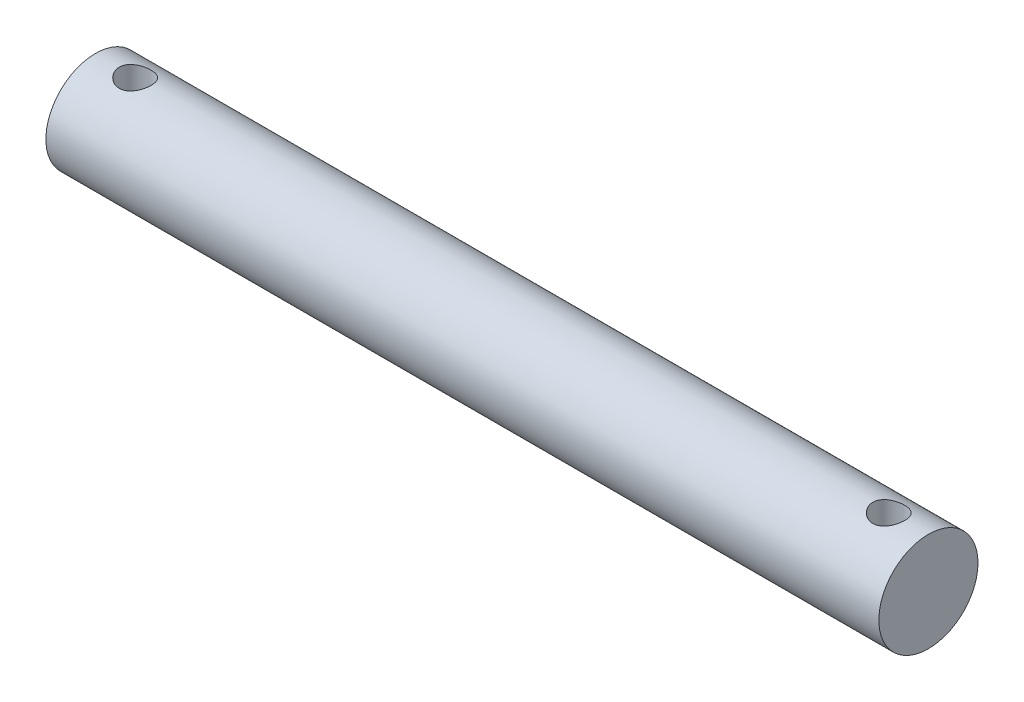
ISO-10303-21;
HEADER;
FILE_DESCRIPTION(('STEP AP214'),'2;1');
FILE_NAME('part.step','',(''),(''),'','','');
FILE_SCHEMA(('AUTOMOTIVE_DESIGN { 1 0 10303 214 1 1 1 1 }'));
ENDSEC;
DATA;
#1=APPLICATION_CONTEXT('core data for automotive mechanical design processes');
#2=APPLICATION_PROTOCOL_DEFINITION('international standard','automotive_design',2000,#1);
#3=PRODUCT_CONTEXT('',#1,'mechanical');
#4=PRODUCT('Part','Part','',(#3));
#5=PRODUCT_RELATED_PRODUCT_CATEGORY('part','',(#4));
#6=PRODUCT_DEFINITION_FORMATION('','',#4);
#7=PRODUCT_DEFINITION_CONTEXT('part definition',#1,'design');
#8=PRODUCT_DEFINITION('design','',#6,#7);
#9=PRODUCT_DEFINITION_SHAPE('','',#8);
#10=(LENGTH_UNIT() NAMED_UNIT(*) SI_UNIT(.MILLI.,.METRE.));
#11=(NAMED_UNIT(*) PLANE_ANGLE_UNIT() SI_UNIT($,.RADIAN.));
#12=(NAMED_UNIT(*) SI_UNIT($,.STERADIAN.) SOLID_ANGLE_UNIT());
#13=UNCERTAINTY_MEASURE_WITH_UNIT(LENGTH_MEASURE(1.E-05),#10,'distance_accuracy_value','');
#14=(GEOMETRIC_REPRESENTATION_CONTEXT(3) GLOBAL_UNCERTAINTY_ASSIGNED_CONTEXT((#13)) GLOBAL_UNIT_ASSIGNED_CONTEXT((#10,
#11,#12)) REPRESENTATION_CONTEXT('',''));
#15=CARTESIAN_POINT('',(0.,0.,0.));
#16=DIRECTION('',(0.,0.,1.));
#17=DIRECTION('',(1.,0.,0.));
#18=AXIS2_PLACEMENT_3D('',#15,#16,#17);
#19=CARTESIAN_POINT('',(210.,0.,0.));
#20=DIRECTION('',(-1.,0.,0.));
#21=DIRECTION('',(0.,0.,1.));
#22=AXIS2_PLACEMENT_3D('',#19,#20,#21);
#23=CYLINDRICAL_SURFACE('',#22,12.5);
#24=CARTESIAN_POINT('',(200.,-11.842719282327,3.99999999999999));
#25=CARTESIAN_POINT('',(200.218415594973,-11.8427199699566,3.99999935935301));
#26=CARTESIAN_POINT('',(200.436838759386,-11.8488277399487,3.98204982916321));
#27=CARTESIAN_POINT('',(200.86724896905,-11.8724842974625,3.91094422931103));
#28=CARTESIAN_POINT('',(201.079234509174,-11.8900357393061,3.85777999166794));
#29=CARTESIAN_POINT('',(201.490470254102,-11.9343925365716,3.71827554706383));
#30=CARTESIAN_POINT('',(201.689743063255,-11.9611808918508,3.6319962541729));
#31=CARTESIAN_POINT('',(202.071044102555,-12.0209691387475,3.42891586136008));
#32=CARTESIAN_POINT('',(202.253069000922,-12.0539702268166,3.31210888071351));
#33=CARTESIAN_POINT('',(202.601265987829,-12.1237992191192,3.04678104882873));
#34=CARTESIAN_POINT('',(202.766725413687,-12.1607169507637,2.89734836823299));
#35=CARTESIAN_POINT('',(203.07071606466,-12.2334570053411,2.57296030582543));
#36=CARTESIAN_POINT('',(203.209243336555,-12.269279166812,2.39800118371828));
#37=CARTESIAN_POINT('',(203.45861346325,-12.3368238271391,2.02237355615694));
#38=CARTESIAN_POINT('',(203.568717873273,-12.3684282786178,1.82119171965248));
#39=CARTESIAN_POINT('',(203.753246409914,-12.4229242661366,1.40198048377137));
#40=CARTESIAN_POINT('',(203.827679354407,-12.4458179551613,1.18395526351672));
#41=CARTESIAN_POINT('',(203.936359448071,-12.479676950379,0.744711775297697));
#42=CARTESIAN_POINT('',(203.971825644154,-12.4910032748545,0.523823472185486));
#43=CARTESIAN_POINT('',(204.005432763753,-12.5017287029849,0.0789603248012319));
#44=CARTESIAN_POINT('',(204.003582572004,-12.5011306457409,-0.145013772077125));
#45=CARTESIAN_POINT('',(203.963401245069,-12.4883236997896,-0.581093729167383));
#46=CARTESIAN_POINT('',(203.926392505398,-12.4765357034484,-0.79333579075878));
#47=CARTESIAN_POINT('',(203.819120441897,-12.4431948493389,-1.20842073412411));
#48=CARTESIAN_POINT('',(203.74885491586,-12.4216413449197,-1.41126299248277));
#49=CARTESIAN_POINT('',(203.576241918706,-12.3706365500491,-1.80478487403706));
#50=CARTESIAN_POINT('',(203.473502046017,-12.3410893332516,-1.99527942968321));
#51=CARTESIAN_POINT('',(203.239174482753,-12.2771970855206,-2.35672859352837));
#52=CARTESIAN_POINT('',(203.10757923132,-12.2428507979634,-2.52767806251325));
#53=CARTESIAN_POINT('',(202.812530895671,-12.1712367294856,-2.85306381310669));
#54=CARTESIAN_POINT('',(202.64793909237,-12.1339068619232,-3.00645534449559));
#55=CARTESIAN_POINT('',(202.295029347537,-12.0618145989439,-3.28378018395938));
#56=CARTESIAN_POINT('',(202.106708326059,-12.0270525377475,-3.40770966195435));
#57=CARTESIAN_POINT('',(201.708608149309,-11.9637089339779,-3.62388810953954));
#58=CARTESIAN_POINT('',(201.498594811739,-11.9352081440021,-3.7157312608837));
#59=CARTESIAN_POINT('',(201.064947984203,-11.8885562852076,-3.86241154371649));
#60=CARTESIAN_POINT('',(200.841319707077,-11.8704012824717,-3.9172627426085));
#61=CARTESIAN_POINT('',(200.396840224735,-11.8473757948988,-3.98634732980606));
#62=CARTESIAN_POINT('',(200.176265879178,-11.8419801089925,-4.0021876938619));
#63=CARTESIAN_POINT('',(199.735589323664,-11.8436224693089,-3.99732669767184));
#64=CARTESIAN_POINT('',(199.515487042269,-11.8506584784444,-3.97663132425953));
#65=CARTESIAN_POINT('',(199.089057431638,-11.8758511036107,-3.90072533361949));
#66=CARTESIAN_POINT('',(198.882514633253,-11.8936586123319,-3.84659716428485));
#67=CARTESIAN_POINT('',(198.48147210065,-11.9380128770361,-3.70664280725108));
#68=CARTESIAN_POINT('',(198.286974399074,-11.9645611032884,-3.62081128645949));
#69=CARTESIAN_POINT('',(197.909130382095,-12.0243860591649,-3.41697396012588));
#70=CARTESIAN_POINT('',(197.726288602977,-12.0578396098649,-3.29808617389175));
#71=CARTESIAN_POINT('',(197.382566444541,-12.1273479833206,-3.03252999413196));
#72=CARTESIAN_POINT('',(197.221692064979,-12.1634035126375,-2.88585403708637));
#73=CARTESIAN_POINT('',(196.919202223414,-12.2359628130699,-2.56125244512297));
#74=CARTESIAN_POINT('',(196.778737996041,-12.2724171226716,-2.38223997872511));
#75=CARTESIAN_POINT('',(196.529787306808,-12.3400966382304,-2.00229721221567));
#76=CARTESIAN_POINT('',(196.421299479696,-12.3713220674134,-1.80136784836229));
#77=CARTESIAN_POINT('',(196.240410006831,-12.4248572290492,-1.38445940226066));
#78=CARTESIAN_POINT('',(196.167754703966,-12.4472294035216,-1.16859881389168));
#79=CARTESIAN_POINT('',(196.060039739723,-12.480810616577,-0.726874957063016));
#80=CARTESIAN_POINT('',(196.024967681683,-12.4920233359687,-0.501015012458277));
#81=CARTESIAN_POINT('',(195.994460730251,-12.5017663129826,-0.0562765879062725));
#82=CARTESIAN_POINT('',(195.997366712425,-12.5008274477244,0.162477761236087));
#83=CARTESIAN_POINT('',(196.038692711946,-12.4876568899275,0.596238594775689));
#84=CARTESIAN_POINT('',(196.077110219501,-12.4754259954572,0.811245342941914));
#85=CARTESIAN_POINT('',(196.187295676915,-12.4412233539435,1.22850760398064));
#86=CARTESIAN_POINT('',(196.258600931114,-12.4193869374855,1.4308971714329));
#87=CARTESIAN_POINT('',(196.432116523931,-12.3682230993078,1.82093134276041));
#88=CARTESIAN_POINT('',(196.534332279587,-12.3388943647058,2.00857335487159));
#89=CARTESIAN_POINT('',(196.770902769464,-12.2745138549376,2.37094464163665));
#90=CARTESIAN_POINT('',(196.906258090511,-12.2392975634481,2.54499113183173));
#91=CARTESIAN_POINT('',(197.203523189601,-12.1675595998111,2.86844801950663));
#92=CARTESIAN_POINT('',(197.365441099235,-12.1310375306124,3.0178508446577));
#93=CARTESIAN_POINT('',(197.71806661409,-12.0592883124172,3.29310491309764));
#94=CARTESIAN_POINT('',(197.909587505179,-12.024152110656,3.41794102245578));
#95=CARTESIAN_POINT('',(198.311961764182,-11.9607741956668,3.63353471705188));
#96=CARTESIAN_POINT('',(198.522808227607,-11.9325300332104,3.72430441468118));
#97=CARTESIAN_POINT('',(198.942457102771,-11.8881467072459,3.86354015966021));
#98=CARTESIAN_POINT('',(199.150337889714,-11.8712893448615,3.91455627646291));
#99=CARTESIAN_POINT('',(199.572144497048,-11.8485768271906,3.98278180434111));
#100=CARTESIAN_POINT('',(199.786068617614,-11.8427186088149,4.00000062749408));
#101=CARTESIAN_POINT('',(200.,-11.842719282327,3.99999999999999));
#102=B_SPLINE_CURVE_WITH_KNOTS('',3,(#24,#25,#26,#27,#28,#29,#30,#31,#32,#33,#34,#35,#36,#37,
#38,#39,#40,#41,#42,#43,#44,#45,#46,#47,#48,#49,#50,#51,#52,#53,#54,#55,#56,#57,#58,#59,#60,#61,
#62,#63,#64,#65,#66,#67,#68,#69,#70,#71,#72,#73,#74,#75,#76,#77,#78,#79,#80,#81,#82,#83,#84,#85,
#86,#87,#88,#89,#90,#91,#92,#93,#94,#95,#96,#97,#98,#99,#100,#101),.UNSPECIFIED.,.T.,.F.,(4,2,2,
2,2,2,2,2,2,2,2,2,2,2,2,2,2,2,2,2,2,2,2,2,2,2,2,2,2,2,2,2,2,2,2,2,2,2,4),(0.,0.654455842715349,
1.309063538331,1.96247283098346,2.61600808653377,3.29090543042413,3.9659017640335,
4.65698443727679,5.34789618881211,6.01651686048923,6.6849783407649,7.32925318507042,
7.97357069810017,8.62599225189612,9.27858496176537,9.95962670810639,10.6407569418194,
11.3302140454822,12.0194088123988,12.6796997833962,13.3398825675734,13.979736408686,
14.6196979341528,15.2787163323881,15.9379143638458,16.6259668097989,17.3139898746477,
17.9970699222357,18.6799245895442,19.3330513205857,19.9861318951797,20.6302921470086,
21.2745653528472,21.9414122843778,22.6084637396798,23.2990150253329,23.9893205507532,
24.6305185843684,25.2715380278761),.UNSPECIFIED.);
#103=CARTESIAN_POINT('',(200.,-11.842719282327,3.99999999999999));
#104=VERTEX_POINT('',#103);
#105=EDGE_CURVE('E10',#104,#104,#102,.T.);
#106=ORIENTED_EDGE('',*,*,#105,.T.);
#107=EDGE_LOOP('',(#106));
#108=FACE_BOUND('',#107,.T.);
#109=CARTESIAN_POINT('',(200.,11.842719282327,3.99999999999999));
#110=CARTESIAN_POINT('',(199.781584405027,11.8427199699566,3.99999935935301));
#111=CARTESIAN_POINT('',(199.563161240614,11.8488277399487,3.98204982916321));
#112=CARTESIAN_POINT('',(199.13275103095,11.8724842974625,3.91094422931103));
#113=CARTESIAN_POINT('',(198.920765490826,11.8900357393061,3.85777999166794));
#114=CARTESIAN_POINT('',(198.509529745898,11.9343925365716,3.71827554706383));
#115=CARTESIAN_POINT('',(198.310256936745,11.9611808918508,3.63199625417291));
#116=CARTESIAN_POINT('',(197.928955897445,12.0209691387475,3.42891586136009));
#117=CARTESIAN_POINT('',(197.746930999078,12.0539702268166,3.31210888071351));
#118=CARTESIAN_POINT('',(197.398734012171,12.1237992191192,3.04678104882872));
#119=CARTESIAN_POINT('',(197.233274586313,12.1607169507637,2.89734836823299));
#120=CARTESIAN_POINT('',(196.92928393534,12.2334570053411,2.57296030582542));
#121=CARTESIAN_POINT('',(196.790756663445,12.269279166812,2.39800118371827));
#122=CARTESIAN_POINT('',(196.54138653675,12.3368238271391,2.02237355615693));
#123=CARTESIAN_POINT('',(196.431282126727,12.3684282786178,1.82119171965248));
#124=CARTESIAN_POINT('',(196.246753590086,12.4229242661366,1.40198048377137));
#125=CARTESIAN_POINT('',(196.172320645593,12.4458179551613,1.18395526351672));
#126=CARTESIAN_POINT('',(196.063640551929,12.479676950379,0.744711775297696));
#127=CARTESIAN_POINT('',(196.028174355846,12.4910032748545,0.523823472185486));
#128=CARTESIAN_POINT('',(195.994567236247,12.5017287029849,0.078960324801232));
#129=CARTESIAN_POINT('',(195.996417427996,12.5011306457409,-0.145013772077125));
#130=CARTESIAN_POINT('',(196.036598754931,12.4883236997896,-0.581093729167383));
#131=CARTESIAN_POINT('',(196.073607494601,12.4765357034484,-0.79333579075878));
#132=CARTESIAN_POINT('',(196.180879558103,12.4431948493389,-1.20842073412411));
#133=CARTESIAN_POINT('',(196.25114508414,12.4216413449197,-1.41126299248277));
#134=CARTESIAN_POINT('',(196.423758081294,12.3706365500491,-1.80478487403706));
#135=CARTESIAN_POINT('',(196.526497953983,12.3410893332516,-1.99527942968321));
#136=CARTESIAN_POINT('',(196.760825517247,12.2771970855206,-2.35672859352837));
#137=CARTESIAN_POINT('',(196.89242076868,12.2428507979634,-2.52767806251325));
#138=CARTESIAN_POINT('',(197.187469104329,12.1712367294856,-2.85306381310669));
#139=CARTESIAN_POINT('',(197.35206090763,12.1339068619232,-3.00645534449559));
#140=CARTESIAN_POINT('',(197.704970652463,12.0618145989439,-3.28378018395938));
#141=CARTESIAN_POINT('',(197.893291673941,12.0270525377475,-3.40770966195435));
#142=CARTESIAN_POINT('',(198.291391850691,11.9637089339779,-3.62388810953955));
#143=CARTESIAN_POINT('',(198.501405188261,11.9352081440021,-3.71573126088371));
#144=CARTESIAN_POINT('',(198.935052015797,11.8885562852076,-3.8624115437165));
#145=CARTESIAN_POINT('',(199.158680292923,11.8704012824717,-3.91726274260851));
#146=CARTESIAN_POINT('',(199.603159775265,11.8473757948988,-3.98634732980606));
#147=CARTESIAN_POINT('',(199.823734120822,11.8419801089925,-4.0021876938619));
#148=CARTESIAN_POINT('',(200.264410676336,11.8436224693089,-3.99732669767183));
#149=CARTESIAN_POINT('',(200.484512957731,11.8506584784444,-3.97663132425952));
#150=CARTESIAN_POINT('',(200.910942568362,11.8758511036107,-3.90072533361949));
#151=CARTESIAN_POINT('',(201.117485366747,11.8936586123319,-3.84659716428485));
#152=CARTESIAN_POINT('',(201.51852789935,11.9380128770361,-3.70664280725108));
#153=CARTESIAN_POINT('',(201.713025600926,11.9645611032884,-3.62081128645949));
#154=CARTESIAN_POINT('',(202.090869617905,12.0243860591649,-3.41697396012588));
#155=CARTESIAN_POINT('',(202.273711397023,12.0578396098649,-3.29808617389175));
#156=CARTESIAN_POINT('',(202.617433555459,12.1273479833206,-3.03252999413196));
#157=CARTESIAN_POINT('',(202.778307935021,12.1634035126375,-2.88585403708637));
#158=CARTESIAN_POINT('',(203.080797776585,12.2359628130699,-2.56125244512297));
#159=CARTESIAN_POINT('',(203.221262003959,12.2724171226716,-2.38223997872511));
#160=CARTESIAN_POINT('',(203.470212693192,12.3400966382304,-2.00229721221567));
#161=CARTESIAN_POINT('',(203.578700520304,12.3713220674134,-1.80136784836229));
#162=CARTESIAN_POINT('',(203.759589993169,12.4248572290492,-1.38445940226066));
#163=CARTESIAN_POINT('',(203.832245296034,12.4472294035216,-1.16859881389168));
#164=CARTESIAN_POINT('',(203.939960260277,12.480810616577,-0.726874957063016));
#165=CARTESIAN_POINT('',(203.975032318317,12.4920233359687,-0.501015012458277));
#166=CARTESIAN_POINT('',(204.005539269749,12.5017663129826,-0.0562765879062725));
#167=CARTESIAN_POINT('',(204.002633287575,12.5008274477244,0.162477761236087));
#168=CARTESIAN_POINT('',(203.961307288054,12.4876568899275,0.596238594775689));
#169=CARTESIAN_POINT('',(203.922889780499,12.4754259954572,0.811245342941915));
#170=CARTESIAN_POINT('',(203.812704323085,12.4412233539435,1.22850760398063));
#171=CARTESIAN_POINT('',(203.741399068886,12.4193869374855,1.43089717143289));
#172=CARTESIAN_POINT('',(203.567883476069,12.3682230993078,1.82093134276041));
#173=CARTESIAN_POINT('',(203.465667720413,12.3388943647058,2.00857335487158));
#174=CARTESIAN_POINT('',(203.229097230536,12.2745138549376,2.37094464163665));
#175=CARTESIAN_POINT('',(203.093741909489,12.2392975634481,2.54499113183173));
#176=CARTESIAN_POINT('',(202.796476810399,12.1675595998111,2.86844801950663));
#177=CARTESIAN_POINT('',(202.634558900765,12.1310375306124,3.0178508446577));
#178=CARTESIAN_POINT('',(202.28193338591,12.0592883124172,3.29310491309764));
#179=CARTESIAN_POINT('',(202.090412494821,12.024152110656,3.41794102245578));
#180=CARTESIAN_POINT('',(201.688038235818,11.9607741956668,3.63353471705188));
#181=CARTESIAN_POINT('',(201.477191772393,11.9325300332104,3.72430441468118));
#182=CARTESIAN_POINT('',(201.057542897229,11.8881467072459,3.86354015966021));
#183=CARTESIAN_POINT('',(200.849662110286,11.8712893448615,3.91455627646291));
#184=CARTESIAN_POINT('',(200.427855502952,11.8485768271906,3.98278180434111));
#185=CARTESIAN_POINT('',(200.213931382386,11.8427186088149,4.00000062749408));
#186=CARTESIAN_POINT('',(200.,11.842719282327,3.99999999999999));
#187=B_SPLINE_CURVE_WITH_KNOTS('',3,(#109,#110,#111,#112,#113,#114,#115,#116,#117,#118,#119,
#120,#121,#122,#123,#124,#125,#126,#127,#128,#129,#130,#131,#132,#133,#134,#135,#136,#137,#138,
#139,#140,#141,#142,#143,#144,#145,#146,#147,#148,#149,#150,#151,#152,#153,#154,#155,#156,#157,
#158,#159,#160,#161,#162,#163,#164,#165,#166,#167,#168,#169,#170,#171,#172,#173,#174,#175,#176,
#177,#178,#179,#180,#181,#182,#183,#184,#185,#186),.UNSPECIFIED.,.T.,.F.,(4,2,2,2,2,2,2,2,2,2,2,
2,2,2,2,2,2,2,2,2,2,2,2,2,2,2,2,2,2,2,2,2,2,2,2,2,2,2,4),(0.,0.654455842715349,1.309063538331,
1.96247283098343,2.61600808653377,3.29090543042416,3.9659017640335,4.65698443727679,
5.34789618881211,6.01651686048923,6.6849783407649,7.32925318507042,7.97357069810017,
8.62599225189612,9.27858496176537,9.95962670810639,10.6407569418194,11.3302140454822,
12.0194088123988,12.6796997833962,13.3398825675734,13.979736408686,14.6196979341528,
15.2787163323881,15.9379143638458,16.6259668097989,17.3139898746477,17.9970699222357,
18.6799245895442,19.3330513205857,19.9861318951797,20.6302921470086,21.2745653528473,
21.9414122843778,22.6084637396798,23.2990150253329,23.9893205507532,24.6305185843684,
25.2715380278761),.UNSPECIFIED.);
#188=CARTESIAN_POINT('',(200.,11.842719282327,3.99999999999999));
#189=VERTEX_POINT('',#188);
#190=EDGE_CURVE('E41',#189,#189,#187,.T.);
#191=ORIENTED_EDGE('',*,*,#190,.T.);
#192=EDGE_LOOP('',(#191));
#193=FACE_BOUND('',#192,.T.);
#194=CARTESIAN_POINT('',(10.,-11.842719282327,4.));
#195=CARTESIAN_POINT('',(10.2184155949729,-11.8427199699566,3.99999935935302));
#196=CARTESIAN_POINT('',(10.4368387593864,-11.8488277399487,3.98204982916322));
#197=CARTESIAN_POINT('',(10.8672489690504,-11.8724842974625,3.91094422931103));
#198=CARTESIAN_POINT('',(11.0792345091736,-11.8900357393061,3.85777999166794));
#199=CARTESIAN_POINT('',(11.4904702541019,-11.9343925365716,3.71827554706383));
#200=CARTESIAN_POINT('',(11.6897430632552,-11.9611808918508,3.6319962541729));
#201=CARTESIAN_POINT('',(12.0710441025551,-12.0209691387475,3.42891586136007));
#202=CARTESIAN_POINT('',(12.2530690009217,-12.0539702268166,3.3121088807135));
#203=CARTESIAN_POINT('',(12.6012659878293,-12.1237992191192,3.04678104882872));
#204=CARTESIAN_POINT('',(12.7667254136869,-12.1607169507637,2.89734836823298));
#205=CARTESIAN_POINT('',(13.0707160646597,-12.2334570053411,2.57296030582542));
#206=CARTESIAN_POINT('',(13.2092433365555,-12.269279166812,2.39800118371827));
#207=CARTESIAN_POINT('',(13.45861346325,-12.3368238271391,2.02237355615693));
#208=CARTESIAN_POINT('',(13.5687178732731,-12.3684282786178,1.82119171965248));
#209=CARTESIAN_POINT('',(13.7532464099141,-12.4229242661366,1.40198048377137));
#210=CARTESIAN_POINT('',(13.8276793544067,-12.4458179551613,1.18395526351671));
#211=CARTESIAN_POINT('',(13.9363594480709,-12.479676950379,0.744711775297691));
#212=CARTESIAN_POINT('',(13.971825644154,-12.4910032748545,0.523823472185481));
#213=CARTESIAN_POINT('',(14.0054327637528,-12.5017287029849,0.0789603248012278));
#214=CARTESIAN_POINT('',(14.0035825720045,-12.5011306457409,-0.145013772077129));
#215=CARTESIAN_POINT('',(13.9634012450691,-12.4883236997896,-0.581093729167386));
#216=CARTESIAN_POINT('',(13.9263925053985,-12.4765357034484,-0.793335790758782));
#217=CARTESIAN_POINT('',(13.8191204418971,-12.4431948493389,-1.20842073412411));
#218=CARTESIAN_POINT('',(13.7488549158599,-12.4216413449197,-1.41126299248278));
#219=CARTESIAN_POINT('',(13.5762419187057,-12.3706365500491,-1.80478487403707));
#220=CARTESIAN_POINT('',(13.473502046017,-12.3410893332516,-1.99527942968321));
#221=CARTESIAN_POINT('',(13.2391744827527,-12.2771970855205,-2.35672859352838));
#222=CARTESIAN_POINT('',(13.1075792313199,-12.2428507979634,-2.52767806251326));
#223=CARTESIAN_POINT('',(12.8125308956707,-12.1712367294856,-2.8530638131067));
#224=CARTESIAN_POINT('',(12.6479390923703,-12.1339068619232,-3.00645534449559));
#225=CARTESIAN_POINT('',(12.2950293475369,-12.0618145989439,-3.28378018395939));
#226=CARTESIAN_POINT('',(12.1067083260587,-12.0270525377475,-3.40770966195435));
#227=CARTESIAN_POINT('',(11.7086081493091,-11.9637089339779,-3.62388810953954));
#228=CARTESIAN_POINT('',(11.498594811739,-11.9352081440021,-3.71573126088371));
#229=CARTESIAN_POINT('',(11.0649479842031,-11.8885562852076,-3.8624115437165));
#230=CARTESIAN_POINT('',(10.8413197070774,-11.8704012824717,-3.91726274260851));
#231=CARTESIAN_POINT('',(10.3968402247348,-11.8473757948988,-3.98634732980607));
#232=CARTESIAN_POINT('',(10.1762658791782,-11.8419801089925,-4.0021876938619));
#233=CARTESIAN_POINT('',(9.73558932366356,-11.8436224693089,-3.99732669767184));
#234=CARTESIAN_POINT('',(9.51548704226901,-11.8506584784444,-3.97663132425953));
#235=CARTESIAN_POINT('',(9.08905743163816,-11.8758511036107,-3.90072533361949));
#236=CARTESIAN_POINT('',(8.88251463325274,-11.8936586123319,-3.84659716428486));
#237=CARTESIAN_POINT('',(8.48147210065042,-11.9380128770361,-3.70664280725107));
#238=CARTESIAN_POINT('',(8.28697439907384,-11.9645611032884,-3.62081128645948));
#239=CARTESIAN_POINT('',(7.90913038209542,-12.0243860591649,-3.41697396012587));
#240=CARTESIAN_POINT('',(7.7262886029767,-12.0578396098649,-3.29808617389175));
#241=CARTESIAN_POINT('',(7.38256644454056,-12.1273479833206,-3.03252999413196));
#242=CARTESIAN_POINT('',(7.22169206497924,-12.1634035126375,-2.88585403708636));
#243=CARTESIAN_POINT('',(6.91920222341449,-12.2359628130699,-2.56125244512296));
#244=CARTESIAN_POINT('',(6.77873799604069,-12.2724171226716,-2.38223997872511));
#245=CARTESIAN_POINT('',(6.52978730680822,-12.3400966382304,-2.00229721221567));
#246=CARTESIAN_POINT('',(6.4212994796963,-12.3713220674134,-1.80136784836229));
#247=CARTESIAN_POINT('',(6.24041000683073,-12.4248572290492,-1.38445940226065));
#248=CARTESIAN_POINT('',(6.16775470396556,-12.4472294035216,-1.16859881389167));
#249=CARTESIAN_POINT('',(6.06003973972317,-12.480810616577,-0.726874957063005));
#250=CARTESIAN_POINT('',(6.02496768168275,-12.4920233359687,-0.501015012458267));
#251=CARTESIAN_POINT('',(5.99446073025063,-12.5017663129826,-0.0562765879062629));
#252=CARTESIAN_POINT('',(5.99736671242526,-12.5008274477244,0.162477761236097));
#253=CARTESIAN_POINT('',(6.03869271194559,-12.4876568899275,0.596238594775697));
#254=CARTESIAN_POINT('',(6.07711021950092,-12.4754259954572,0.81124534294192));
#255=CARTESIAN_POINT('',(6.1872956769149,-12.4412233539435,1.22850760398064));
#256=CARTESIAN_POINT('',(6.25860093111413,-12.4193869374855,1.4308971714329));
#257=CARTESIAN_POINT('',(6.43211652393071,-12.3682230993078,1.82093134276042));
#258=CARTESIAN_POINT('',(6.53433227958656,-12.3388943647058,2.00857335487159));
#259=CARTESIAN_POINT('',(6.77090276946352,-12.2745138549376,2.37094464163666));
#260=CARTESIAN_POINT('',(6.90625809051103,-12.2392975634481,2.54499113183174));
#261=CARTESIAN_POINT('',(7.20352318960092,-12.1675595998111,2.86844801950663));
#262=CARTESIAN_POINT('',(7.36544109923522,-12.1310375306124,3.0178508446577));
#263=CARTESIAN_POINT('',(7.71806661409039,-12.0592883124172,3.29310491309765));
#264=CARTESIAN_POINT('',(7.90958750517858,-12.0241521106559,3.41794102245578));
#265=CARTESIAN_POINT('',(8.31196176418228,-11.9607741956668,3.63353471705189));
#266=CARTESIAN_POINT('',(8.52280822760683,-11.9325300332104,3.72430441468119));
#267=CARTESIAN_POINT('',(8.94245710277082,-11.8881467072459,3.86354015966022));
#268=CARTESIAN_POINT('',(9.15033788971429,-11.8712893448615,3.91455627646292));
#269=CARTESIAN_POINT('',(9.57214449704751,-11.8485768271906,3.98278180434112));
#270=CARTESIAN_POINT('',(9.78606861761364,-11.8427186088149,4.00000062749409));
#271=CARTESIAN_POINT('',(10.,-11.842719282327,4.));
#272=B_SPLINE_CURVE_WITH_KNOTS('',3,(#194,#195,#196,#197,#198,#199,#200,#201,#202,#203,#204,
#205,#206,#207,#208,#209,#210,#211,#212,#213,#214,#215,#216,#217,#218,#219,#220,#221,#222,#223,
#224,#225,#226,#227,#228,#229,#230,#231,#232,#233,#234,#235,#236,#237,#238,#239,#240,#241,#242,
#243,#244,#245,#246,#247,#248,#249,#250,#251,#252,#253,#254,#255,#256,#257,#258,#259,#260,#261,
#262,#263,#264,#265,#266,#267,#268,#269,#270,#271),.UNSPECIFIED.,.T.,.F.,(4,2,2,2,2,2,2,2,2,2,2,
2,2,2,2,2,2,2,2,2,2,2,2,2,2,2,2,2,2,2,2,2,2,2,2,2,2,2,4),(0.,0.654455842715354,1.309063538331,
1.96247283098349,2.6160080865338,3.29090543042416,3.96590176403351,4.65698443727681,
5.34789618881212,6.01651686048925,6.68497834076492,7.32925318507043,7.9735706981002,
8.62599225189614,9.27858496176539,9.95962670810642,10.6407569418194,11.3302140454822,
12.0194088123988,12.6796997833962,13.3398825675735,13.979736408686,14.6196979341528,
15.2787163323882,15.9379143638459,16.6259668097989,17.3139898746478,17.9970699222358,
18.6799245895442,19.3330513205858,19.9861318951797,20.6302921470087,21.2745653528473,
21.9414122843778,22.6084637396799,23.2990150253329,23.9893205507533,24.6305185843684,
25.2715380278761),.UNSPECIFIED.);
#273=CARTESIAN_POINT('',(10.,-11.842719282327,4.));
#274=VERTEX_POINT('',#273);
#275=EDGE_CURVE('E45',#274,#274,#272,.T.);
#276=ORIENTED_EDGE('',*,*,#275,.T.);
#277=EDGE_LOOP('',(#276));
#278=FACE_BOUND('',#277,.T.);
#279=CARTESIAN_POINT('',(10.,11.842719282327,4.));
#280=CARTESIAN_POINT('',(9.78158440502711,11.8427199699566,3.99999935935302));
#281=CARTESIAN_POINT('',(9.56316124061358,11.8488277399487,3.98204982916322));
#282=CARTESIAN_POINT('',(9.1327510309496,11.8724842974625,3.91094422931103));
#283=CARTESIAN_POINT('',(8.92076549082645,11.8900357393061,3.85777999166794));
#284=CARTESIAN_POINT('',(8.50952974589806,11.9343925365716,3.71827554706383));
#285=CARTESIAN_POINT('',(8.31025693674485,11.9611808918508,3.6319962541729));
#286=CARTESIAN_POINT('',(7.92895589744494,12.0209691387475,3.42891586136007));
#287=CARTESIAN_POINT('',(7.74693099907831,12.0539702268166,3.3121088807135));
#288=CARTESIAN_POINT('',(7.39873401217067,12.1237992191192,3.04678104882872));
#289=CARTESIAN_POINT('',(7.23327458631313,12.1607169507637,2.89734836823298));
#290=CARTESIAN_POINT('',(6.92928393534029,12.2334570053411,2.57296030582542));
#291=CARTESIAN_POINT('',(6.79075666344453,12.269279166812,2.39800118371827));
#292=CARTESIAN_POINT('',(6.54138653675002,12.3368238271391,2.02237355615693));
#293=CARTESIAN_POINT('',(6.43128212672686,12.3684282786178,1.82119171965248));
#294=CARTESIAN_POINT('',(6.24675359008593,12.4229242661366,1.40198048377137));
#295=CARTESIAN_POINT('',(6.1723206455933,12.4458179551613,1.18395526351671));
#296=CARTESIAN_POINT('',(6.06364055192911,12.479676950379,0.744711775297691));
#297=CARTESIAN_POINT('',(6.02817435584598,12.4910032748545,0.523823472185481));
#298=CARTESIAN_POINT('',(5.99456723624724,12.5017287029849,0.0789603248012279));
#299=CARTESIAN_POINT('',(5.99641742799553,12.5011306457409,-0.145013772077129));
#300=CARTESIAN_POINT('',(6.03659875493092,12.4883236997896,-0.581093729167386));
#301=CARTESIAN_POINT('',(6.07360749460149,12.4765357034484,-0.793335790758782));
#302=CARTESIAN_POINT('',(6.18087955810294,12.4431948493389,-1.20842073412411));
#303=CARTESIAN_POINT('',(6.25114508414008,12.4216413449197,-1.41126299248278));
#304=CARTESIAN_POINT('',(6.4237580812943,12.3706365500491,-1.80478487403707));
#305=CARTESIAN_POINT('',(6.52649795398296,12.3410893332516,-1.99527942968321));
#306=CARTESIAN_POINT('',(6.76082551724733,12.2771970855205,-2.35672859352838));
#307=CARTESIAN_POINT('',(6.89242076868011,12.2428507979634,-2.52767806251326));
#308=CARTESIAN_POINT('',(7.18746910432926,12.1712367294856,-2.8530638131067));
#309=CARTESIAN_POINT('',(7.35206090762969,12.1339068619231,-3.0064553444956));
#310=CARTESIAN_POINT('',(7.7049706524631,12.0618145989439,-3.28378018395939));
#311=CARTESIAN_POINT('',(7.89329167394133,12.0270525377475,-3.40770966195435));
#312=CARTESIAN_POINT('',(8.29139185069088,11.9637089339779,-3.62388810953954));
#313=CARTESIAN_POINT('',(8.50140518826098,11.9352081440021,-3.71573126088371));
#314=CARTESIAN_POINT('',(8.93505201579693,11.8885562852076,-3.8624115437165));
#315=CARTESIAN_POINT('',(9.15868029292261,11.8704012824717,-3.91726274260851));
#316=CARTESIAN_POINT('',(9.6031597752652,11.8473757948988,-3.98634732980607));
#317=CARTESIAN_POINT('',(9.82373412082183,11.8419801089925,-4.0021876938619));
#318=CARTESIAN_POINT('',(10.2644106763364,11.8436224693089,-3.99732669767184));
#319=CARTESIAN_POINT('',(10.484512957731,11.8506584784444,-3.97663132425953));
#320=CARTESIAN_POINT('',(10.9109425683618,11.8758511036107,-3.90072533361949));
#321=CARTESIAN_POINT('',(11.1174853667473,11.8936586123319,-3.84659716428486));
#322=CARTESIAN_POINT('',(11.5185278993496,11.9380128770361,-3.70664280725108));
#323=CARTESIAN_POINT('',(11.7130256009262,11.9645611032884,-3.62081128645948));
#324=CARTESIAN_POINT('',(12.0908696179046,12.0243860591649,-3.41697396012587));
#325=CARTESIAN_POINT('',(12.2737113970233,12.0578396098649,-3.29808617389174));
#326=CARTESIAN_POINT('',(12.6174335554594,12.1273479833206,-3.03252999413196));
#327=CARTESIAN_POINT('',(12.7783079350208,12.1634035126375,-2.88585403708636));
#328=CARTESIAN_POINT('',(13.0807977765855,12.2359628130699,-2.56125244512296));
#329=CARTESIAN_POINT('',(13.2212620039593,12.2724171226716,-2.3822399787251));
#330=CARTESIAN_POINT('',(13.4702126931918,12.3400966382304,-2.00229721221567));
#331=CARTESIAN_POINT('',(13.5787005203037,12.3713220674134,-1.80136784836229));
#332=CARTESIAN_POINT('',(13.7595899931693,12.4248572290492,-1.38445940226065));
#333=CARTESIAN_POINT('',(13.8322452960344,12.4472294035216,-1.16859881389167));
#334=CARTESIAN_POINT('',(13.9399602602768,12.480810616577,-0.726874957063003));
#335=CARTESIAN_POINT('',(13.9750323183173,12.4920233359687,-0.501015012458264));
#336=CARTESIAN_POINT('',(14.0055392697494,12.5017663129826,-0.0562765879062596));
#337=CARTESIAN_POINT('',(14.0026332875747,12.5008274477244,0.1624777612361));
#338=CARTESIAN_POINT('',(13.9613072880544,12.4876568899275,0.5962385947757));
#339=CARTESIAN_POINT('',(13.9228897804991,12.4754259954572,0.811245342941923));
#340=CARTESIAN_POINT('',(13.8127043230851,12.4412233539435,1.22850760398064));
#341=CARTESIAN_POINT('',(13.7413990688859,12.4193869374855,1.4308971714329));
#342=CARTESIAN_POINT('',(13.5678834760693,12.3682230993078,1.82093134276042));
#343=CARTESIAN_POINT('',(13.4656677204134,12.3388943647058,2.00857335487159));
#344=CARTESIAN_POINT('',(13.2290972305365,12.2745138549376,2.37094464163666));
#345=CARTESIAN_POINT('',(13.093741909489,12.2392975634481,2.54499113183174));
#346=CARTESIAN_POINT('',(12.7964768103991,12.1675595998111,2.86844801950664));
#347=CARTESIAN_POINT('',(12.6345589007648,12.1310375306124,3.0178508446577));
#348=CARTESIAN_POINT('',(12.2819333859096,12.0592883124172,3.29310491309765));
#349=CARTESIAN_POINT('',(12.0904124948214,12.0241521106559,3.41794102245578));
#350=CARTESIAN_POINT('',(11.6880382358177,11.9607741956668,3.63353471705189));
#351=CARTESIAN_POINT('',(11.4771917723932,11.9325300332104,3.72430441468119));
#352=CARTESIAN_POINT('',(11.0575428972292,11.8881467072459,3.86354015966022));
#353=CARTESIAN_POINT('',(10.8496621102857,11.8712893448615,3.91455627646292));
#354=CARTESIAN_POINT('',(10.4278555029525,11.8485768271906,3.98278180434112));
#355=CARTESIAN_POINT('',(10.2139313823864,11.8427186088149,4.00000062749409));
#356=CARTESIAN_POINT('',(10.,11.842719282327,4.));
#357=B_SPLINE_CURVE_WITH_KNOTS('',3,(#279,#280,#281,#282,#283,#284,#285,#286,#287,#288,#289,
#290,#291,#292,#293,#294,#295,#296,#297,#298,#299,#300,#301,#302,#303,#304,#305,#306,#307,#308,
#309,#310,#311,#312,#313,#314,#315,#316,#317,#318,#319,#320,#321,#322,#323,#324,#325,#326,#327,
#328,#329,#330,#331,#332,#333,#334,#335,#336,#337,#338,#339,#340,#341,#342,#343,#344,#345,#346,
#347,#348,#349,#350,#351,#352,#353,#354,#355,#356),.UNSPECIFIED.,.T.,.F.,(4,2,2,2,2,2,2,2,2,2,2,
2,2,2,2,2,2,2,2,2,2,2,2,2,2,2,2,2,2,2,2,2,2,2,2,2,2,2,4),(0.,0.654455842715354,1.309063538331,
1.96247283098349,2.6160080865338,3.29090543042416,3.96590176403351,4.65698443727681,
5.34789618881213,6.01651686048925,6.68497834076492,7.32925318507043,7.9735706981002,
8.62599225189614,9.27858496176539,9.95962670810642,10.6407569418194,11.3302140454822,
12.0194088123988,12.6796997833962,13.3398825675735,13.979736408686,14.6196979341528,
15.2787163323882,15.9379143638459,16.6259668097989,17.3139898746478,17.9970699222358,
18.6799245895443,19.3330513205858,19.9861318951797,20.6302921470087,21.2745653528473,
21.9414122843778,22.6084637396799,23.2990150253329,23.9893205507533,24.6305185843684,
25.2715380278761),.UNSPECIFIED.);
#358=CARTESIAN_POINT('',(10.,11.842719282327,4.));
#359=VERTEX_POINT('',#358);
#360=EDGE_CURVE('E49',#359,#359,#357,.T.);
#361=ORIENTED_EDGE('',*,*,#360,.T.);
#362=EDGE_LOOP('',(#361));
#363=FACE_BOUND('',#362,.T.);
#364=CARTESIAN_POINT('',(210.,0.,0.));
#365=DIRECTION('',(1.,0.,0.));
#366=DIRECTION('',(0.,0.,-1.));
#367=AXIS2_PLACEMENT_3D('',#364,#365,#366);
#368=CIRCLE('',#367,12.5);
#369=CARTESIAN_POINT('',(210.,0.,-12.5));
#370=VERTEX_POINT('',#369);
#371=EDGE_CURVE('E74',#370,#370,#368,.T.);
#372=ORIENTED_EDGE('',*,*,#371,.F.);
#373=EDGE_LOOP('',(#372));
#374=FACE_BOUND('',#373,.T.);
#375=CARTESIAN_POINT('',(0.,0.,0.));
#376=DIRECTION('',(1.,0.,0.));
#377=DIRECTION('',(0.,0.,-1.));
#378=AXIS2_PLACEMENT_3D('',#375,#376,#377);
#379=CIRCLE('',#378,12.5);
#380=CARTESIAN_POINT('',(0.,0.,-12.5));
#381=VERTEX_POINT('',#380);
#382=EDGE_CURVE('E75',#381,#381,#379,.T.);
#383=ORIENTED_EDGE('',*,*,#382,.T.);
#384=EDGE_LOOP('',(#383));
#385=FACE_BOUND('',#384,.T.);
#386=ADVANCED_FACE('F31',(#108,#193,#278,#363,#374,#385),#23,.T.);
#387=CARTESIAN_POINT('',(210.,0.,0.));
#388=DIRECTION('',(1.,0.,0.));
#389=DIRECTION('',(0.,0.,-1.));
#390=AXIS2_PLACEMENT_3D('',#387,#388,#389);
#391=PLANE('',#390);
#392=ORIENTED_EDGE('',*,*,#371,.T.);
#393=EDGE_LOOP('',(#392));
#394=FACE_BOUND('',#393,.T.);
#395=ADVANCED_FACE('F68',(#394),#391,.T.);
#396=CARTESIAN_POINT('',(0.,0.,0.));
#397=DIRECTION('',(1.,0.,0.));
#398=DIRECTION('',(0.,0.,-1.));
#399=AXIS2_PLACEMENT_3D('',#396,#397,#398);
#400=PLANE('',#399);
#401=ORIENTED_EDGE('',*,*,#382,.F.);
#402=EDGE_LOOP('',(#401));
#403=FACE_BOUND('',#402,.T.);
#404=ADVANCED_FACE('F66',(#403),#400,.F.);
#405=CARTESIAN_POINT('',(10.,-12.5,0.));
#406=DIRECTION('',(0.,1.,0.));
#407=DIRECTION('',(0.,0.,1.));
#408=AXIS2_PLACEMENT_3D('',#405,#406,#407);
#409=CYLINDRICAL_SURFACE('',#408,4.);
#410=ORIENTED_EDGE('',*,*,#360,.F.);
#411=EDGE_LOOP('',(#410));
#412=FACE_BOUND('',#411,.T.);
#413=ORIENTED_EDGE('',*,*,#275,.F.);
#414=EDGE_LOOP('',(#413));
#415=FACE_BOUND('',#414,.T.);
#416=ADVANCED_FACE('F60',(#412,#415),#409,.F.);
#417=CARTESIAN_POINT('',(200.,-12.5,0.));
#418=DIRECTION('',(0.,1.,0.));
#419=DIRECTION('',(0.,0.,1.));
#420=AXIS2_PLACEMENT_3D('',#417,#418,#419);
#421=CYLINDRICAL_SURFACE('',#420,3.99999999999999);
#422=ORIENTED_EDGE('',*,*,#190,.F.);
#423=EDGE_LOOP('',(#422));
#424=FACE_BOUND('',#423,.T.);
#425=ORIENTED_EDGE('',*,*,#105,.F.);
#426=EDGE_LOOP('',(#425));
#427=FACE_BOUND('',#426,.T.);
#428=ADVANCED_FACE('F57',(#424,#427),#421,.F.);
#429=CLOSED_SHELL('',(#386,#395,#404,#416,#428));
#430=MANIFOLD_SOLID_BREP('B2',#429);
#431=ADVANCED_BREP_SHAPE_REPRESENTATION('',(#18,#430),#14);
#432=SHAPE_DEFINITION_REPRESENTATION(#9,#431);
ENDSEC;
END-ISO-10303-21;
